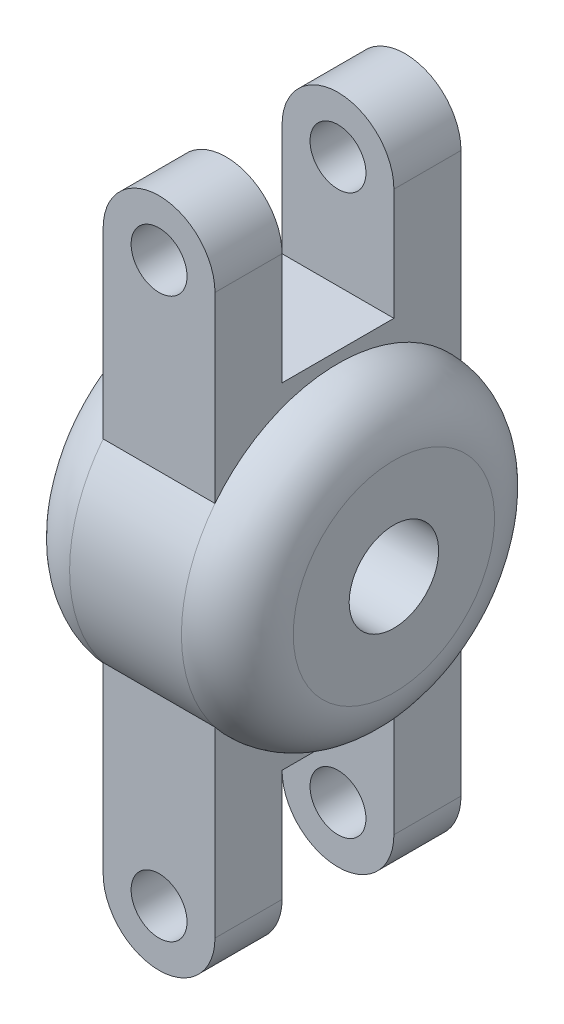
ISO-10303-21;
HEADER;
FILE_DESCRIPTION(('STEP AP214'),'2;1');
FILE_NAME('part.step','',(''),(''),'','','');
FILE_SCHEMA(('AUTOMOTIVE_DESIGN { 1 0 10303 214 1 1 1 1 }'));
ENDSEC;
DATA;
#1=APPLICATION_CONTEXT('core data for automotive mechanical design processes');
#2=APPLICATION_PROTOCOL_DEFINITION('international standard','automotive_design',2000,#1);
#3=PRODUCT_CONTEXT('',#1,'mechanical');
#4=PRODUCT('Part','Part','',(#3));
#5=PRODUCT_RELATED_PRODUCT_CATEGORY('part','',(#4));
#6=PRODUCT_DEFINITION_FORMATION('','',#4);
#7=PRODUCT_DEFINITION_CONTEXT('part definition',#1,'design');
#8=PRODUCT_DEFINITION('design','',#6,#7);
#9=PRODUCT_DEFINITION_SHAPE('','',#8);
#10=(LENGTH_UNIT() NAMED_UNIT(*) SI_UNIT(.MILLI.,.METRE.));
#11=(NAMED_UNIT(*) PLANE_ANGLE_UNIT() SI_UNIT($,.RADIAN.));
#12=(NAMED_UNIT(*) SI_UNIT($,.STERADIAN.) SOLID_ANGLE_UNIT());
#13=UNCERTAINTY_MEASURE_WITH_UNIT(LENGTH_MEASURE(1.E-05),#10,'distance_accuracy_value','');
#14=(GEOMETRIC_REPRESENTATION_CONTEXT(3) GLOBAL_UNCERTAINTY_ASSIGNED_CONTEXT((#13)) GLOBAL_UNIT_ASSIGNED_CONTEXT((#10,
#11,#12)) REPRESENTATION_CONTEXT('',''));
#15=CARTESIAN_POINT('',(0.,0.,0.));
#16=DIRECTION('',(0.,0.,1.));
#17=DIRECTION('',(1.,0.,0.));
#18=AXIS2_PLACEMENT_3D('',#15,#16,#17);
#19=CARTESIAN_POINT('',(44.0528610380754,-4.,11.));
#20=DIRECTION('',(1.,0.,0.));
#21=DIRECTION('',(0.,1.,0.));
#22=AXIS2_PLACEMENT_3D('',#19,#20,#21);
#23=PLANE('',#22);
#24=DIRECTION('',(0.,0.,1.));
#25=VECTOR('',#24,1.);
#26=CARTESIAN_POINT('',(44.0528610380754,-15.,-5.));
#27=LINE('',#26,#25);
#28=CARTESIAN_POINT('',(44.0528610380754,-15.,-5.));
#29=VERTEX_POINT('',#28);
#30=CARTESIAN_POINT('',(44.0528610380754,-15.,5.));
#31=VERTEX_POINT('',#30);
#32=EDGE_CURVE('E166',#29,#31,#27,.T.);
#33=ORIENTED_EDGE('',*,*,#32,.F.);
#34=DIRECTION('',(0.,-1.,0.));
#35=VECTOR('',#34,1.);
#36=CARTESIAN_POINT('',(44.0528610380754,-15.,-5.));
#37=LINE('',#36,#35);
#38=CARTESIAN_POINT('',(44.0528610380754,-25.,-5.));
#39=VERTEX_POINT('',#38);
#40=EDGE_CURVE('E152',#29,#39,#37,.T.);
#41=ORIENTED_EDGE('',*,*,#40,.T.);
#42=DIRECTION('',(0.,0.,-1.));
#43=VECTOR('',#42,1.);
#44=CARTESIAN_POINT('',(44.0528610380754,-25.,11.));
#45=LINE('',#44,#43);
#46=CARTESIAN_POINT('',(44.0528610380754,-25.,-11.));
#47=VERTEX_POINT('',#46);
#48=EDGE_CURVE('E163',#39,#47,#45,.T.);
#49=ORIENTED_EDGE('',*,*,#48,.T.);
#50=DIRECTION('',(0.,-1.,0.));
#51=VECTOR('',#50,1.);
#52=CARTESIAN_POINT('',(44.0528610380754,-4.,-11.));
#53=LINE('',#52,#51);
#54=CARTESIAN_POINT('',(44.0528610380754,-8.66025403784439,-11.));
#55=VERTEX_POINT('',#54);
#56=EDGE_CURVE('E292',#55,#47,#53,.T.);
#57=ORIENTED_EDGE('',*,*,#56,.F.);
#58=CARTESIAN_POINT('',(44.0528610380753,0.,0.));
#59=DIRECTION('',(-1.,0.,0.));
#60=DIRECTION('',(0.,0.,1.));
#61=AXIS2_PLACEMENT_3D('',#58,#59,#60);
#62=CIRCLE('',#61,14.);
#63=CARTESIAN_POINT('',(44.0528610380754,-8.66025403784439,11.));
#64=VERTEX_POINT('',#63);
#65=EDGE_CURVE('E305',#55,#64,#62,.T.);
#66=ORIENTED_EDGE('',*,*,#65,.T.);
#67=DIRECTION('',(0.,-1.,0.));
#68=VECTOR('',#67,1.);
#69=CARTESIAN_POINT('',(44.0528610380754,-4.,11.));
#70=LINE('',#69,#68);
#71=CARTESIAN_POINT('',(44.0528610380754,-25.,11.));
#72=VERTEX_POINT('',#71);
#73=EDGE_CURVE('E295',#64,#72,#70,.T.);
#74=ORIENTED_EDGE('',*,*,#73,.T.);
#75=CARTESIAN_POINT('',(44.0528610380754,-25.,5.));
#76=VERTEX_POINT('',#75);
#77=EDGE_CURVE('E173',#72,#76,#45,.T.);
#78=ORIENTED_EDGE('',*,*,#77,.T.);
#79=DIRECTION('',(0.,-1.,0.));
#80=VECTOR('',#79,1.);
#81=CARTESIAN_POINT('',(44.0528610380754,-15.,5.));
#82=LINE('',#81,#80);
#83=EDGE_CURVE('E49',#31,#76,#82,.T.);
#84=ORIENTED_EDGE('',*,*,#83,.F.);
#85=EDGE_LOOP('',(#33,#41,#49,#57,#66,#74,#78,#84));
#86=FACE_BOUND('',#85,.T.);
#87=ADVANCED_FACE('F32',(#86),#23,.T.);
#88=CARTESIAN_POINT('',(34.0528610380754,-4.,11.));
#89=DIRECTION('',(-1.,0.,0.));
#90=DIRECTION('',(0.,0.,1.));
#91=AXIS2_PLACEMENT_3D('',#88,#89,#90);
#92=PLANE('',#91);
#93=DIRECTION('',(0.,0.,-1.));
#94=VECTOR('',#93,1.);
#95=CARTESIAN_POINT('',(34.0528610380754,-25.,11.));
#96=LINE('',#95,#94);
#97=CARTESIAN_POINT('',(34.0528610380754,-25.,-5.));
#98=VERTEX_POINT('',#97);
#99=CARTESIAN_POINT('',(34.0528610380754,-25.,-11.));
#100=VERTEX_POINT('',#99);
#101=EDGE_CURVE('E177',#98,#100,#96,.T.);
#102=ORIENTED_EDGE('',*,*,#101,.F.);
#103=DIRECTION('',(0.,1.,0.));
#104=VECTOR('',#103,1.);
#105=CARTESIAN_POINT('',(34.0528610380754,-25.,-5.));
#106=LINE('',#105,#104);
#107=CARTESIAN_POINT('',(34.0528610380754,-15.,-5.));
#108=VERTEX_POINT('',#107);
#109=EDGE_CURVE('E155',#98,#108,#106,.T.);
#110=ORIENTED_EDGE('',*,*,#109,.T.);
#111=DIRECTION('',(0.,0.,1.));
#112=VECTOR('',#111,1.);
#113=CARTESIAN_POINT('',(34.0528610380754,-15.,-5.));
#114=LINE('',#113,#112);
#115=CARTESIAN_POINT('',(34.0528610380754,-15.,5.));
#116=VERTEX_POINT('',#115);
#117=EDGE_CURVE('E277',#108,#116,#114,.T.);
#118=ORIENTED_EDGE('',*,*,#117,.T.);
#119=DIRECTION('',(0.,1.,0.));
#120=VECTOR('',#119,1.);
#121=CARTESIAN_POINT('',(34.0528610380754,-25.,5.));
#122=LINE('',#121,#120);
#123=CARTESIAN_POINT('',(34.0528610380754,-25.,5.));
#124=VERTEX_POINT('',#123);
#125=EDGE_CURVE('E159',#124,#116,#122,.T.);
#126=ORIENTED_EDGE('',*,*,#125,.F.);
#127=CARTESIAN_POINT('',(34.0528610380754,-25.,11.));
#128=VERTEX_POINT('',#127);
#129=EDGE_CURVE('E183',#128,#124,#96,.T.);
#130=ORIENTED_EDGE('',*,*,#129,.F.);
#131=DIRECTION('',(0.,1.,0.));
#132=VECTOR('',#131,1.);
#133=CARTESIAN_POINT('',(34.0528610380754,-4.,11.));
#134=LINE('',#133,#132);
#135=CARTESIAN_POINT('',(34.0528610380754,-8.66025403784439,11.));
#136=VERTEX_POINT('',#135);
#137=EDGE_CURVE('E57',#128,#136,#134,.T.);
#138=ORIENTED_EDGE('',*,*,#137,.T.);
#139=CARTESIAN_POINT('',(34.0528610380754,0.,0.));
#140=DIRECTION('',(-1.,0.,0.));
#141=DIRECTION('',(0.,0.,1.));
#142=AXIS2_PLACEMENT_3D('',#139,#140,#141);
#143=CIRCLE('',#142,14.);
#144=CARTESIAN_POINT('',(34.0528610380754,-8.66025403784439,-11.));
#145=VERTEX_POINT('',#144);
#146=EDGE_CURVE('E363',#145,#136,#143,.T.);
#147=ORIENTED_EDGE('',*,*,#146,.F.);
#148=DIRECTION('',(0.,1.,0.));
#149=VECTOR('',#148,1.);
#150=CARTESIAN_POINT('',(34.0528610380754,-4.,-11.));
#151=LINE('',#150,#149);
#152=EDGE_CURVE('E298',#100,#145,#151,.T.);
#153=ORIENTED_EDGE('',*,*,#152,.F.);
#154=EDGE_LOOP('',(#102,#110,#118,#126,#130,#138,#147,#153));
#155=FACE_BOUND('',#154,.T.);
#156=ADVANCED_FACE('F362',(#155),#92,.T.);
#157=CARTESIAN_POINT('',(39.0528610380754,-25.,11.));
#158=DIRECTION('',(0.,0.,-1.));
#159=DIRECTION('',(-1.,0.,0.));
#160=AXIS2_PLACEMENT_3D('',#157,#158,#159);
#161=CYLINDRICAL_SURFACE('',#160,5.);
#162=ORIENTED_EDGE('',*,*,#48,.F.);
#163=CARTESIAN_POINT('',(39.0528610380754,-25.,-5.));
#164=DIRECTION('',(0.,0.,-1.));
#165=DIRECTION('',(1.,0.,0.));
#166=AXIS2_PLACEMENT_3D('',#163,#164,#165);
#167=CIRCLE('',#166,5.);
#168=EDGE_CURVE('E147',#39,#98,#167,.T.);
#169=ORIENTED_EDGE('',*,*,#168,.T.);
#170=ORIENTED_EDGE('',*,*,#101,.T.);
#171=CARTESIAN_POINT('',(39.0528610380754,-25.,-11.));
#172=DIRECTION('',(0.,0.,-1.));
#173=DIRECTION('',(1.,0.,0.));
#174=AXIS2_PLACEMENT_3D('',#171,#172,#173);
#175=CIRCLE('',#174,5.);
#176=EDGE_CURVE('E172',#47,#100,#175,.T.);
#177=ORIENTED_EDGE('',*,*,#176,.F.);
#178=EDGE_LOOP('',(#162,#169,#170,#177));
#179=FACE_BOUND('',#178,.T.);
#180=ADVANCED_FACE('F170',(#179),#161,.T.);
#181=CARTESIAN_POINT('',(39.0528610380754,-25.,11.));
#182=DIRECTION('',(0.,0.,-1.));
#183=DIRECTION('',(-1.,0.,0.));
#184=AXIS2_PLACEMENT_3D('',#181,#182,#183);
#185=CYLINDRICAL_SURFACE('',#184,2.5);
#186=CARTESIAN_POINT('',(39.0528610380754,-25.,-11.));
#187=DIRECTION('',(0.,0.,-1.));
#188=DIRECTION('',(1.,0.,0.));
#189=AXIS2_PLACEMENT_3D('',#186,#187,#188);
#190=CIRCLE('',#189,2.5);
#191=CARTESIAN_POINT('',(41.5528610380754,-25.,-11.));
#192=VERTEX_POINT('',#191);
#193=EDGE_CURVE('E281',#192,#192,#190,.T.);
#194=ORIENTED_EDGE('',*,*,#193,.T.);
#195=EDGE_LOOP('',(#194));
#196=FACE_BOUND('',#195,.T.);
#197=CARTESIAN_POINT('',(39.0528610380754,-25.,-5.));
#198=DIRECTION('',(0.,0.,1.));
#199=DIRECTION('',(1.,0.,0.));
#200=AXIS2_PLACEMENT_3D('',#197,#198,#199);
#201=CIRCLE('',#200,2.5);
#202=CARTESIAN_POINT('',(41.5528610380754,-25.,-5.));
#203=VERTEX_POINT('',#202);
#204=EDGE_CURVE('E36',#203,#203,#201,.F.);
#205=ORIENTED_EDGE('',*,*,#204,.F.);
#206=EDGE_LOOP('',(#205));
#207=FACE_BOUND('',#206,.T.);
#208=ADVANCED_FACE('F491',(#196,#207),#185,.F.);
#209=CARTESIAN_POINT('',(27.6320773492058,0.,0.));
#210=DIRECTION('',(-1.,0.,0.));
#211=DIRECTION('',(0.,0.,1.));
#212=AXIS2_PLACEMENT_3D('',#209,#210,#211);
#213=CYLINDRICAL_SURFACE('',#212,14.);
#214=DIRECTION('',(-1.,0.,0.));
#215=VECTOR('',#214,1.);
#216=CARTESIAN_POINT('',(27.6320773492058,-8.66025403784439,-11.));
#217=LINE('',#216,#215);
#218=EDGE_CURVE('E186',#145,#55,#217,.F.);
#219=ORIENTED_EDGE('',*,*,#218,.F.);
#220=CARTESIAN_POINT('',(34.0528610380754,8.66025403784439,-11.));
#221=VERTEX_POINT('',#220);
#222=EDGE_CURVE('E228',#221,#145,#143,.T.);
#223=ORIENTED_EDGE('',*,*,#222,.F.);
#224=DIRECTION('',(-1.,0.,0.));
#225=VECTOR('',#224,1.);
#226=CARTESIAN_POINT('',(27.6320773492058,8.66025403784439,-11.));
#227=LINE('',#226,#225);
#228=CARTESIAN_POINT('',(44.0528610380754,8.66025403784439,-11.));
#229=VERTEX_POINT('',#228);
#230=EDGE_CURVE('E241',#221,#229,#227,.F.);
#231=ORIENTED_EDGE('',*,*,#230,.T.);
#232=EDGE_CURVE('E232',#229,#55,#62,.T.);
#233=ORIENTED_EDGE('',*,*,#232,.T.);
#234=EDGE_LOOP('',(#219,#223,#231,#233));
#235=FACE_BOUND('',#234,.T.);
#236=ADVANCED_FACE('F315',(#235),#213,.T.);
#237=CARTESIAN_POINT('',(44.0528610380754,4.,11.));
#238=DIRECTION('',(-1.,0.,0.));
#239=DIRECTION('',(0.,-1.,0.));
#240=AXIS2_PLACEMENT_3D('',#237,#238,#239);
#241=PLANE('',#240);
#242=DIRECTION('',(0.,1.,0.));
#243=VECTOR('',#242,1.);
#244=CARTESIAN_POINT('',(44.0528610380754,15.,-5.));
#245=LINE('',#244,#243);
#246=CARTESIAN_POINT('',(44.0528610380754,15.,-5.));
#247=VERTEX_POINT('',#246);
#248=CARTESIAN_POINT('',(44.0528610380754,25.,-5.));
#249=VERTEX_POINT('',#248);
#250=EDGE_CURVE('E201',#247,#249,#245,.T.);
#251=ORIENTED_EDGE('',*,*,#250,.F.);
#252=DIRECTION('',(0.,0.,1.));
#253=VECTOR('',#252,1.);
#254=CARTESIAN_POINT('',(44.0528610380754,15.,-5.));
#255=LINE('',#254,#253);
#256=CARTESIAN_POINT('',(44.0528610380754,15.,5.));
#257=VERTEX_POINT('',#256);
#258=EDGE_CURVE('E213',#247,#257,#255,.T.);
#259=ORIENTED_EDGE('',*,*,#258,.T.);
#260=DIRECTION('',(0.,1.,0.));
#261=VECTOR('',#260,1.);
#262=CARTESIAN_POINT('',(44.0528610380754,15.,5.));
#263=LINE('',#262,#261);
#264=CARTESIAN_POINT('',(44.0528610380754,25.,5.));
#265=VERTEX_POINT('',#264);
#266=EDGE_CURVE('E195',#257,#265,#263,.T.);
#267=ORIENTED_EDGE('',*,*,#266,.T.);
#268=DIRECTION('',(0.,0.,-1.));
#269=VECTOR('',#268,1.);
#270=CARTESIAN_POINT('',(44.0528610380754,25.,11.));
#271=LINE('',#270,#269);
#272=CARTESIAN_POINT('',(44.0528610380754,25.,11.));
#273=VERTEX_POINT('',#272);
#274=EDGE_CURVE('E11',#273,#265,#271,.T.);
#275=ORIENTED_EDGE('',*,*,#274,.F.);
#276=DIRECTION('',(0.,1.,0.));
#277=VECTOR('',#276,1.);
#278=CARTESIAN_POINT('',(44.0528610380754,4.,11.));
#279=LINE('',#278,#277);
#280=CARTESIAN_POINT('',(44.0528610380754,8.66025403784439,11.));
#281=VERTEX_POINT('',#280);
#282=EDGE_CURVE('E254',#281,#273,#279,.T.);
#283=ORIENTED_EDGE('',*,*,#282,.F.);
#284=EDGE_CURVE('E229',#281,#229,#62,.T.);
#285=ORIENTED_EDGE('',*,*,#284,.T.);
#286=DIRECTION('',(0.,1.,0.));
#287=VECTOR('',#286,1.);
#288=CARTESIAN_POINT('',(44.0528610380754,4.,-11.));
#289=LINE('',#288,#287);
#290=CARTESIAN_POINT('',(44.0528610380754,25.,-11.));
#291=VERTEX_POINT('',#290);
#292=EDGE_CURVE('E251',#229,#291,#289,.T.);
#293=ORIENTED_EDGE('',*,*,#292,.T.);
#294=EDGE_CURVE('E41',#249,#291,#271,.T.);
#295=ORIENTED_EDGE('',*,*,#294,.F.);
#296=EDGE_LOOP('',(#251,#259,#267,#275,#283,#285,#293,#295));
#297=FACE_BOUND('',#296,.T.);
#298=ADVANCED_FACE('F34',(#297),#241,.F.);
#299=CARTESIAN_POINT('',(39.0528610380754,25.,11.));
#300=DIRECTION('',(0.,0.,-1.));
#301=DIRECTION('',(-1.,0.,0.));
#302=AXIS2_PLACEMENT_3D('',#299,#300,#301);
#303=CYLINDRICAL_SURFACE('',#302,5.);
#304=CARTESIAN_POINT('',(39.0528610380754,25.,-5.));
#305=DIRECTION('',(0.,0.,1.));
#306=DIRECTION('',(1.,0.,0.));
#307=AXIS2_PLACEMENT_3D('',#304,#305,#306);
#308=CIRCLE('',#307,5.);
#309=CARTESIAN_POINT('',(34.0528610380754,25.,-5.));
#310=VERTEX_POINT('',#309);
#311=EDGE_CURVE('E192',#249,#310,#308,.T.);
#312=ORIENTED_EDGE('',*,*,#311,.F.);
#313=ORIENTED_EDGE('',*,*,#294,.T.);
#314=CARTESIAN_POINT('',(39.0528610380754,25.,-11.));
#315=DIRECTION('',(0.,0.,1.));
#316=DIRECTION('',(1.,0.,0.));
#317=AXIS2_PLACEMENT_3D('',#314,#315,#316);
#318=CIRCLE('',#317,5.);
#319=CARTESIAN_POINT('',(34.0528610380754,25.,-11.));
#320=VERTEX_POINT('',#319);
#321=EDGE_CURVE('E265',#291,#320,#318,.T.);
#322=ORIENTED_EDGE('',*,*,#321,.T.);
#323=DIRECTION('',(0.,0.,-1.));
#324=VECTOR('',#323,1.);
#325=CARTESIAN_POINT('',(34.0528610380754,25.,11.));
#326=LINE('',#325,#324);
#327=EDGE_CURVE('E262',#310,#320,#326,.T.);
#328=ORIENTED_EDGE('',*,*,#327,.F.);
#329=EDGE_LOOP('',(#312,#313,#322,#328));
#330=FACE_BOUND('',#329,.T.);
#331=ADVANCED_FACE('F406',(#330),#303,.T.);
#332=CARTESIAN_POINT('',(34.0528610380754,4.,11.));
#333=DIRECTION('',(1.,0.,0.));
#334=DIRECTION('',(0.,0.,-1.));
#335=AXIS2_PLACEMENT_3D('',#332,#333,#334);
#336=PLANE('',#335);
#337=DIRECTION('',(0.,-1.,0.));
#338=VECTOR('',#337,1.);
#339=CARTESIAN_POINT('',(34.0528610380754,25.,-5.));
#340=LINE('',#339,#338);
#341=CARTESIAN_POINT('',(34.0528610380754,15.,-5.));
#342=VERTEX_POINT('',#341);
#343=EDGE_CURVE('E194',#310,#342,#340,.T.);
#344=ORIENTED_EDGE('',*,*,#343,.F.);
#345=ORIENTED_EDGE('',*,*,#327,.T.);
#346=DIRECTION('',(0.,-1.,0.));
#347=VECTOR('',#346,1.);
#348=CARTESIAN_POINT('',(34.0528610380754,4.,-11.));
#349=LINE('',#348,#347);
#350=EDGE_CURVE('E257',#320,#221,#349,.T.);
#351=ORIENTED_EDGE('',*,*,#350,.T.);
#352=CARTESIAN_POINT('',(34.0528610380754,8.66025403784439,11.));
#353=VERTEX_POINT('',#352);
#354=EDGE_CURVE('E224',#353,#221,#143,.T.);
#355=ORIENTED_EDGE('',*,*,#354,.F.);
#356=DIRECTION('',(0.,-1.,0.));
#357=VECTOR('',#356,1.);
#358=CARTESIAN_POINT('',(34.0528610380754,4.,11.));
#359=LINE('',#358,#357);
#360=CARTESIAN_POINT('',(34.0528610380754,25.,11.));
#361=VERTEX_POINT('',#360);
#362=EDGE_CURVE('E259',#361,#353,#359,.T.);
#363=ORIENTED_EDGE('',*,*,#362,.F.);
#364=CARTESIAN_POINT('',(34.0528610380754,25.,5.));
#365=VERTEX_POINT('',#364);
#366=EDGE_CURVE('E269',#361,#365,#326,.T.);
#367=ORIENTED_EDGE('',*,*,#366,.T.);
#368=DIRECTION('',(0.,-1.,0.));
#369=VECTOR('',#368,1.);
#370=CARTESIAN_POINT('',(34.0528610380754,25.,5.));
#371=LINE('',#370,#369);
#372=CARTESIAN_POINT('',(34.0528610380754,15.,5.));
#373=VERTEX_POINT('',#372);
#374=EDGE_CURVE('E206',#365,#373,#371,.T.);
#375=ORIENTED_EDGE('',*,*,#374,.T.);
#376=DIRECTION('',(0.,0.,1.));
#377=VECTOR('',#376,1.);
#378=CARTESIAN_POINT('',(34.0528610380754,15.,-5.));
#379=LINE('',#378,#377);
#380=EDGE_CURVE('E203',#342,#373,#379,.T.);
#381=ORIENTED_EDGE('',*,*,#380,.F.);
#382=EDGE_LOOP('',(#344,#345,#351,#355,#363,#367,#375,#381));
#383=FACE_BOUND('',#382,.T.);
#384=ADVANCED_FACE('F340',(#383),#336,.F.);
#385=CARTESIAN_POINT('',(39.0528610380754,25.,11.));
#386=DIRECTION('',(0.,0.,-1.));
#387=DIRECTION('',(-1.,0.,0.));
#388=AXIS2_PLACEMENT_3D('',#385,#386,#387);
#389=CYLINDRICAL_SURFACE('',#388,2.5);
#390=CARTESIAN_POINT('',(39.0528610380754,25.,-11.));
#391=DIRECTION('',(0.,0.,1.));
#392=DIRECTION('',(1.,0.,0.));
#393=AXIS2_PLACEMENT_3D('',#390,#391,#392);
#394=CIRCLE('',#393,2.5);
#395=CARTESIAN_POINT('',(41.5528610380754,25.,-11.));
#396=VERTEX_POINT('',#395);
#397=EDGE_CURVE('E247',#396,#396,#394,.T.);
#398=ORIENTED_EDGE('',*,*,#397,.F.);
#399=EDGE_LOOP('',(#398));
#400=FACE_BOUND('',#399,.T.);
#401=CARTESIAN_POINT('',(39.0528610380754,25.,-5.));
#402=DIRECTION('',(0.,0.,1.));
#403=DIRECTION('',(1.,0.,0.));
#404=AXIS2_PLACEMENT_3D('',#401,#402,#403);
#405=CIRCLE('',#404,2.5);
#406=CARTESIAN_POINT('',(41.5528610380754,25.,-5.));
#407=VERTEX_POINT('',#406);
#408=EDGE_CURVE('E223',#407,#407,#405,.T.);
#409=ORIENTED_EDGE('',*,*,#408,.T.);
#410=EDGE_LOOP('',(#409));
#411=FACE_BOUND('',#410,.T.);
#412=ADVANCED_FACE('F412',(#400,#411),#389,.F.);
#413=CARTESIAN_POINT('',(39.0528610380754,25.,11.));
#414=DIRECTION('',(0.,0.,1.));
#415=DIRECTION('',(1.,0.,0.));
#416=AXIS2_PLACEMENT_3D('',#413,#414,#415);
#417=PLANE('',#416);
#418=CARTESIAN_POINT('',(39.0528610380754,25.,11.));
#419=DIRECTION('',(0.,0.,1.));
#420=DIRECTION('',(1.,0.,0.));
#421=AXIS2_PLACEMENT_3D('',#418,#419,#420);
#422=CIRCLE('',#421,2.5);
#423=CARTESIAN_POINT('',(41.5528610380754,25.,11.));
#424=VERTEX_POINT('',#423);
#425=EDGE_CURVE('E248',#424,#424,#422,.T.);
#426=ORIENTED_EDGE('',*,*,#425,.F.);
#427=EDGE_LOOP('',(#426));
#428=FACE_BOUND('',#427,.T.);
#429=ORIENTED_EDGE('',*,*,#362,.T.);
#430=DIRECTION('',(-1.,0.,0.));
#431=VECTOR('',#430,1.);
#432=CARTESIAN_POINT('',(27.6320773492058,8.66025403784439,11.));
#433=LINE('',#432,#431);
#434=EDGE_CURVE('E244',#353,#281,#433,.F.);
#435=ORIENTED_EDGE('',*,*,#434,.T.);
#436=ORIENTED_EDGE('',*,*,#282,.T.);
#437=CARTESIAN_POINT('',(39.0528610380754,25.,11.));
#438=DIRECTION('',(0.,0.,1.));
#439=DIRECTION('',(1.,0.,0.));
#440=AXIS2_PLACEMENT_3D('',#437,#438,#439);
#441=CIRCLE('',#440,5.);
#442=EDGE_CURVE('E256',#273,#361,#441,.T.);
#443=ORIENTED_EDGE('',*,*,#442,.T.);
#444=EDGE_LOOP('',(#429,#435,#436,#443));
#445=FACE_BOUND('',#444,.T.);
#446=ADVANCED_FACE('F331',(#428,#445),#417,.T.);
#447=CARTESIAN_POINT('',(39.0528610380754,25.,-11.));
#448=DIRECTION('',(0.,0.,1.));
#449=DIRECTION('',(1.,0.,0.));
#450=AXIS2_PLACEMENT_3D('',#447,#448,#449);
#451=PLANE('',#450);
#452=ORIENTED_EDGE('',*,*,#397,.T.);
#453=EDGE_LOOP('',(#452));
#454=FACE_BOUND('',#453,.T.);
#455=ORIENTED_EDGE('',*,*,#230,.F.);
#456=ORIENTED_EDGE('',*,*,#350,.F.);
#457=ORIENTED_EDGE('',*,*,#321,.F.);
#458=ORIENTED_EDGE('',*,*,#292,.F.);
#459=EDGE_LOOP('',(#455,#456,#457,#458));
#460=FACE_BOUND('',#459,.T.);
#461=ADVANCED_FACE('F322',(#454,#460),#451,.F.);
#462=ORIENTED_EDGE('',*,*,#274,.T.);
#463=CARTESIAN_POINT('',(39.0528610380754,25.,5.));
#464=DIRECTION('',(0.,0.,1.));
#465=DIRECTION('',(1.,0.,0.));
#466=AXIS2_PLACEMENT_3D('',#463,#464,#465);
#467=CIRCLE('',#466,5.);
#468=EDGE_CURVE('E191',#265,#365,#467,.T.);
#469=ORIENTED_EDGE('',*,*,#468,.T.);
#470=ORIENTED_EDGE('',*,*,#366,.F.);
#471=ORIENTED_EDGE('',*,*,#442,.F.);
#472=EDGE_LOOP('',(#462,#469,#470,#471));
#473=FACE_BOUND('',#472,.T.);
#474=ADVANCED_FACE('F335',(#473),#303,.T.);
#475=CARTESIAN_POINT('',(39.0528610380754,25.,5.));
#476=DIRECTION('',(0.,0.,1.));
#477=DIRECTION('',(1.,0.,0.));
#478=AXIS2_PLACEMENT_3D('',#475,#476,#477);
#479=CIRCLE('',#478,2.5);
#480=CARTESIAN_POINT('',(41.5528610380754,25.,5.));
#481=VERTEX_POINT('',#480);
#482=EDGE_CURVE('E216',#481,#481,#479,.T.);
#483=ORIENTED_EDGE('',*,*,#482,.F.);
#484=EDGE_LOOP('',(#483));
#485=FACE_BOUND('',#484,.T.);
#486=ORIENTED_EDGE('',*,*,#425,.T.);
#487=EDGE_LOOP('',(#486));
#488=FACE_BOUND('',#487,.T.);
#489=ADVANCED_FACE('F415',(#485,#488),#389,.F.);
#490=CARTESIAN_POINT('',(29.0528610380754,4.,0.));
#491=DIRECTION('',(1.,0.,0.));
#492=DIRECTION('',(0.,0.,-1.));
#493=AXIS2_PLACEMENT_3D('',#490,#491,#492);
#494=PLANE('',#493);
#495=CARTESIAN_POINT('',(29.0528610380754,0.,0.));
#496=DIRECTION('',(-1.,0.,0.));
#497=DIRECTION('',(0.,0.,1.));
#498=AXIS2_PLACEMENT_3D('',#495,#496,#497);
#499=CIRCLE('',#498,4.);
#500=CARTESIAN_POINT('',(29.0528610380754,0.,4.));
#501=VERTEX_POINT('',#500);
#502=EDGE_CURVE('E238',#501,#501,#499,.T.);
#503=ORIENTED_EDGE('',*,*,#502,.F.);
#504=EDGE_LOOP('',(#503));
#505=FACE_BOUND('',#504,.T.);
#506=CARTESIAN_POINT('',(29.0528610380754,0.,0.));
#507=DIRECTION('',(-1.,0.,0.));
#508=DIRECTION('',(0.,0.,1.));
#509=AXIS2_PLACEMENT_3D('',#506,#507,#508);
#510=CIRCLE('',#509,8.99999999999997);
#511=CARTESIAN_POINT('',(29.0528610380754,0.,8.99999999999997));
#512=VERTEX_POINT('',#511);
#513=EDGE_CURVE('E219',#512,#512,#510,.T.);
#514=ORIENTED_EDGE('',*,*,#513,.T.);
#515=EDGE_LOOP('',(#514));
#516=FACE_BOUND('',#515,.T.);
#517=ADVANCED_FACE('F420',(#505,#516),#494,.F.);
#518=CARTESIAN_POINT('',(27.6320773492058,0.,0.));
#519=DIRECTION('',(-1.,0.,0.));
#520=DIRECTION('',(0.,0.,1.));
#521=AXIS2_PLACEMENT_3D('',#518,#519,#520);
#522=CYLINDRICAL_SURFACE('',#521,4.);
#523=CARTESIAN_POINT('',(49.0528610380754,0.,0.));
#524=DIRECTION('',(-1.,0.,0.));
#525=DIRECTION('',(0.,0.,1.));
#526=AXIS2_PLACEMENT_3D('',#523,#524,#525);
#527=CIRCLE('',#526,4.);
#528=CARTESIAN_POINT('',(49.0528610380754,0.,4.));
#529=VERTEX_POINT('',#528);
#530=EDGE_CURVE('E235',#529,#529,#527,.T.);
#531=ORIENTED_EDGE('',*,*,#530,.F.);
#532=EDGE_LOOP('',(#531));
#533=FACE_BOUND('',#532,.T.);
#534=ORIENTED_EDGE('',*,*,#502,.T.);
#535=EDGE_LOOP('',(#534));
#536=FACE_BOUND('',#535,.T.);
#537=ADVANCED_FACE('F433',(#533,#536),#522,.F.);
#538=CARTESIAN_POINT('',(49.0528610380754,4.,0.));
#539=DIRECTION('',(-1.,0.,0.));
#540=DIRECTION('',(0.,0.,1.));
#541=AXIS2_PLACEMENT_3D('',#538,#539,#540);
#542=PLANE('',#541);
#543=CARTESIAN_POINT('',(49.0528610380754,0.,0.));
#544=DIRECTION('',(-1.,0.,0.));
#545=DIRECTION('',(0.,0.,1.));
#546=AXIS2_PLACEMENT_3D('',#543,#544,#545);
#547=CIRCLE('',#546,8.99999999999997);
#548=CARTESIAN_POINT('',(49.0528610380754,0.,8.99999999999997));
#549=VERTEX_POINT('',#548);
#550=EDGE_CURVE('E231',#549,#549,#547,.T.);
#551=ORIENTED_EDGE('',*,*,#550,.F.);
#552=EDGE_LOOP('',(#551));
#553=FACE_BOUND('',#552,.T.);
#554=ORIENTED_EDGE('',*,*,#530,.T.);
#555=EDGE_LOOP('',(#554));
#556=FACE_BOUND('',#555,.T.);
#557=ADVANCED_FACE('F437',(#553,#556),#542,.F.);
#558=CARTESIAN_POINT('',(44.0528610380754,0.,0.));
#559=DIRECTION('',(-1.,0.,0.));
#560=DIRECTION('',(0.,0.,1.));
#561=AXIS2_PLACEMENT_3D('',#558,#559,#560);
#562=TOROIDAL_SURFACE('',#561,9.,5.);
#563=ORIENTED_EDGE('',*,*,#284,.F.);
#564=EDGE_CURVE('E227',#64,#281,#62,.T.);
#565=ORIENTED_EDGE('',*,*,#564,.F.);
#566=ORIENTED_EDGE('',*,*,#65,.F.);
#567=ORIENTED_EDGE('',*,*,#232,.F.);
#568=EDGE_LOOP('',(#563,#565,#566,#567));
#569=FACE_BOUND('',#568,.T.);
#570=ORIENTED_EDGE('',*,*,#550,.T.);
#571=EDGE_LOOP('',(#570));
#572=FACE_BOUND('',#571,.T.);
#573=ADVANCED_FACE('F312',(#569,#572),#562,.T.);
#574=EDGE_CURVE('E222',#136,#353,#143,.T.);
#575=ORIENTED_EDGE('',*,*,#574,.F.);
#576=DIRECTION('',(-1.,0.,0.));
#577=VECTOR('',#576,1.);
#578=CARTESIAN_POINT('',(27.6320773492058,-8.66025403784439,11.));
#579=LINE('',#578,#577);
#580=EDGE_CURVE('E188',#136,#64,#579,.F.);
#581=ORIENTED_EDGE('',*,*,#580,.T.);
#582=ORIENTED_EDGE('',*,*,#564,.T.);
#583=ORIENTED_EDGE('',*,*,#434,.F.);
#584=EDGE_LOOP('',(#575,#581,#582,#583));
#585=FACE_BOUND('',#584,.T.);
#586=ADVANCED_FACE('F343',(#585),#213,.T.);
#587=CARTESIAN_POINT('',(34.0528610380754,0.,0.));
#588=DIRECTION('',(-1.,0.,0.));
#589=DIRECTION('',(0.,0.,1.));
#590=AXIS2_PLACEMENT_3D('',#587,#588,#589);
#591=TOROIDAL_SURFACE('',#590,9.,5.);
#592=ORIENTED_EDGE('',*,*,#513,.F.);
#593=EDGE_LOOP('',(#592));
#594=FACE_BOUND('',#593,.T.);
#595=ORIENTED_EDGE('',*,*,#354,.T.);
#596=ORIENTED_EDGE('',*,*,#222,.T.);
#597=ORIENTED_EDGE('',*,*,#146,.T.);
#598=ORIENTED_EDGE('',*,*,#574,.T.);
#599=EDGE_LOOP('',(#595,#596,#597,#598));
#600=FACE_BOUND('',#599,.T.);
#601=ADVANCED_FACE('F365',(#594,#600),#591,.T.);
#602=CARTESIAN_POINT('',(34.0528610380754,15.,-5.));
#603=DIRECTION('',(0.,-1.,0.));
#604=DIRECTION('',(0.,0.,-1.));
#605=AXIS2_PLACEMENT_3D('',#602,#603,#604);
#606=PLANE('',#605);
#607=DIRECTION('',(1.,0.,0.));
#608=VECTOR('',#607,1.);
#609=CARTESIAN_POINT('',(34.0528610380754,15.,5.));
#610=LINE('',#609,#608);
#611=EDGE_CURVE('E209',#373,#257,#610,.T.);
#612=ORIENTED_EDGE('',*,*,#611,.T.);
#613=ORIENTED_EDGE('',*,*,#258,.F.);
#614=DIRECTION('',(1.,0.,0.));
#615=VECTOR('',#614,1.);
#616=CARTESIAN_POINT('',(34.0528610380754,15.,-5.));
#617=LINE('',#616,#615);
#618=EDGE_CURVE('E198',#342,#247,#617,.T.);
#619=ORIENTED_EDGE('',*,*,#618,.F.);
#620=ORIENTED_EDGE('',*,*,#380,.T.);
#621=EDGE_LOOP('',(#612,#613,#619,#620));
#622=FACE_BOUND('',#621,.T.);
#623=ADVANCED_FACE('F367',(#622),#606,.F.);
#624=CARTESIAN_POINT('',(39.0528610380754,25.,-5.));
#625=DIRECTION('',(0.,0.,1.));
#626=DIRECTION('',(1.,0.,0.));
#627=AXIS2_PLACEMENT_3D('',#624,#625,#626);
#628=PLANE('',#627);
#629=ORIENTED_EDGE('',*,*,#408,.F.);
#630=EDGE_LOOP('',(#629));
#631=FACE_BOUND('',#630,.T.);
#632=ORIENTED_EDGE('',*,*,#311,.T.);
#633=ORIENTED_EDGE('',*,*,#343,.T.);
#634=ORIENTED_EDGE('',*,*,#618,.T.);
#635=ORIENTED_EDGE('',*,*,#250,.T.);
#636=EDGE_LOOP('',(#632,#633,#634,#635));
#637=FACE_BOUND('',#636,.T.);
#638=ADVANCED_FACE('F374',(#631,#637),#628,.T.);
#639=CARTESIAN_POINT('',(39.0528610380754,25.,5.));
#640=DIRECTION('',(0.,0.,1.));
#641=DIRECTION('',(1.,0.,0.));
#642=AXIS2_PLACEMENT_3D('',#639,#640,#641);
#643=PLANE('',#642);
#644=ORIENTED_EDGE('',*,*,#482,.T.);
#645=EDGE_LOOP('',(#644));
#646=FACE_BOUND('',#645,.T.);
#647=ORIENTED_EDGE('',*,*,#468,.F.);
#648=ORIENTED_EDGE('',*,*,#266,.F.);
#649=ORIENTED_EDGE('',*,*,#611,.F.);
#650=ORIENTED_EDGE('',*,*,#374,.F.);
#651=EDGE_LOOP('',(#647,#648,#649,#650));
#652=FACE_BOUND('',#651,.T.);
#653=ADVANCED_FACE('F389',(#646,#652),#643,.F.);
#654=CARTESIAN_POINT('',(39.0528610380754,-25.,11.));
#655=DIRECTION('',(0.,0.,1.));
#656=DIRECTION('',(1.,0.,0.));
#657=AXIS2_PLACEMENT_3D('',#654,#655,#656);
#658=PLANE('',#657);
#659=CARTESIAN_POINT('',(39.0528610380754,-25.,11.));
#660=DIRECTION('',(0.,0.,-1.));
#661=DIRECTION('',(1.,0.,0.));
#662=AXIS2_PLACEMENT_3D('',#659,#660,#661);
#663=CIRCLE('',#662,2.5);
#664=CARTESIAN_POINT('',(41.5528610380754,-25.,11.));
#665=VERTEX_POINT('',#664);
#666=EDGE_CURVE('E289',#665,#665,#663,.T.);
#667=ORIENTED_EDGE('',*,*,#666,.T.);
#668=EDGE_LOOP('',(#667));
#669=FACE_BOUND('',#668,.T.);
#670=ORIENTED_EDGE('',*,*,#580,.F.);
#671=ORIENTED_EDGE('',*,*,#137,.F.);
#672=CARTESIAN_POINT('',(39.0528610380754,-25.,11.));
#673=DIRECTION('',(0.,0.,-1.));
#674=DIRECTION('',(1.,0.,0.));
#675=AXIS2_PLACEMENT_3D('',#672,#673,#674);
#676=CIRCLE('',#675,5.);
#677=EDGE_CURVE('E174',#72,#128,#676,.T.);
#678=ORIENTED_EDGE('',*,*,#677,.F.);
#679=ORIENTED_EDGE('',*,*,#73,.F.);
#680=EDGE_LOOP('',(#670,#671,#678,#679));
#681=FACE_BOUND('',#680,.T.);
#682=ADVANCED_FACE('F346',(#669,#681),#658,.T.);
#683=CARTESIAN_POINT('',(39.0528610380754,-25.,-11.));
#684=DIRECTION('',(0.,0.,1.));
#685=DIRECTION('',(1.,0.,0.));
#686=AXIS2_PLACEMENT_3D('',#683,#684,#685);
#687=PLANE('',#686);
#688=ORIENTED_EDGE('',*,*,#193,.F.);
#689=EDGE_LOOP('',(#688));
#690=FACE_BOUND('',#689,.T.);
#691=ORIENTED_EDGE('',*,*,#152,.T.);
#692=ORIENTED_EDGE('',*,*,#218,.T.);
#693=ORIENTED_EDGE('',*,*,#56,.T.);
#694=ORIENTED_EDGE('',*,*,#176,.T.);
#695=EDGE_LOOP('',(#691,#692,#693,#694));
#696=FACE_BOUND('',#695,.T.);
#697=ADVANCED_FACE('F303',(#690,#696),#687,.F.);
#698=CARTESIAN_POINT('',(39.0528610380754,-25.,5.));
#699=DIRECTION('',(0.,0.,-1.));
#700=DIRECTION('',(1.,0.,0.));
#701=AXIS2_PLACEMENT_3D('',#698,#699,#700);
#702=CIRCLE('',#701,5.);
#703=EDGE_CURVE('E351',#76,#124,#702,.T.);
#704=ORIENTED_EDGE('',*,*,#703,.F.);
#705=ORIENTED_EDGE('',*,*,#77,.F.);
#706=ORIENTED_EDGE('',*,*,#677,.T.);
#707=ORIENTED_EDGE('',*,*,#129,.T.);
#708=EDGE_LOOP('',(#704,#705,#706,#707));
#709=FACE_BOUND('',#708,.T.);
#710=ADVANCED_FACE('F350',(#709),#161,.T.);
#711=CARTESIAN_POINT('',(39.0528610380754,-25.,5.));
#712=DIRECTION('',(0.,0.,1.));
#713=DIRECTION('',(1.,0.,0.));
#714=AXIS2_PLACEMENT_3D('',#711,#712,#713);
#715=CIRCLE('',#714,2.5);
#716=CARTESIAN_POINT('',(41.5528610380754,-25.,5.));
#717=VERTEX_POINT('',#716);
#718=EDGE_CURVE('E275',#717,#717,#715,.F.);
#719=ORIENTED_EDGE('',*,*,#718,.T.);
#720=EDGE_LOOP('',(#719));
#721=FACE_BOUND('',#720,.T.);
#722=ORIENTED_EDGE('',*,*,#666,.F.);
#723=EDGE_LOOP('',(#722));
#724=FACE_BOUND('',#723,.T.);
#725=ADVANCED_FACE('F482',(#721,#724),#185,.F.);
#726=CARTESIAN_POINT('',(39.0528610380754,-25.,-5.));
#727=DIRECTION('',(0.,0.,1.));
#728=DIRECTION('',(1.,0.,0.));
#729=AXIS2_PLACEMENT_3D('',#726,#727,#728);
#730=PLANE('',#729);
#731=ORIENTED_EDGE('',*,*,#168,.F.);
#732=ORIENTED_EDGE('',*,*,#40,.F.);
#733=DIRECTION('',(1.,0.,0.));
#734=VECTOR('',#733,1.);
#735=CARTESIAN_POINT('',(34.0528610380754,-15.,-5.));
#736=LINE('',#735,#734);
#737=EDGE_CURVE('E167',#108,#29,#736,.T.);
#738=ORIENTED_EDGE('',*,*,#737,.F.);
#739=ORIENTED_EDGE('',*,*,#109,.F.);
#740=EDGE_LOOP('',(#731,#732,#738,#739));
#741=FACE_BOUND('',#740,.T.);
#742=ORIENTED_EDGE('',*,*,#204,.T.);
#743=EDGE_LOOP('',(#742));
#744=FACE_BOUND('',#743,.T.);
#745=ADVANCED_FACE('F149',(#741,#744),#730,.T.);
#746=CARTESIAN_POINT('',(39.0528610380754,-25.,5.));
#747=DIRECTION('',(0.,0.,1.));
#748=DIRECTION('',(1.,0.,0.));
#749=AXIS2_PLACEMENT_3D('',#746,#747,#748);
#750=PLANE('',#749);
#751=ORIENTED_EDGE('',*,*,#703,.T.);
#752=ORIENTED_EDGE('',*,*,#125,.T.);
#753=DIRECTION('',(1.,0.,0.));
#754=VECTOR('',#753,1.);
#755=CARTESIAN_POINT('',(34.0528610380754,-15.,5.));
#756=LINE('',#755,#754);
#757=EDGE_CURVE('E353',#116,#31,#756,.T.);
#758=ORIENTED_EDGE('',*,*,#757,.T.);
#759=ORIENTED_EDGE('',*,*,#83,.T.);
#760=EDGE_LOOP('',(#751,#752,#758,#759));
#761=FACE_BOUND('',#760,.T.);
#762=ORIENTED_EDGE('',*,*,#718,.F.);
#763=EDGE_LOOP('',(#762));
#764=FACE_BOUND('',#763,.T.);
#765=ADVANCED_FACE('F358',(#761,#764),#750,.F.);
#766=CARTESIAN_POINT('',(34.0528610380754,-15.,-5.));
#767=DIRECTION('',(0.,-1.,0.));
#768=DIRECTION('',(0.,0.,-1.));
#769=AXIS2_PLACEMENT_3D('',#766,#767,#768);
#770=PLANE('',#769);
#771=ORIENTED_EDGE('',*,*,#757,.F.);
#772=ORIENTED_EDGE('',*,*,#117,.F.);
#773=ORIENTED_EDGE('',*,*,#737,.T.);
#774=ORIENTED_EDGE('',*,*,#32,.T.);
#775=EDGE_LOOP('',(#771,#772,#773,#774));
#776=FACE_BOUND('',#775,.T.);
#777=ADVANCED_FACE('F361',(#776),#770,.T.);
#778=CLOSED_SHELL('',(#87,#156,#180,#208,#236,#298,#331,#384,#412,#446,#461,#474,#489,#517,#537,
#557,#573,#586,#601,#623,#638,#653,#682,#697,#710,#725,#745,#765,#777));
#779=MANIFOLD_SOLID_BREP('B2',#778);
#780=ADVANCED_BREP_SHAPE_REPRESENTATION('',(#18,#779),#14);
#781=SHAPE_DEFINITION_REPRESENTATION(#9,#780);
ENDSEC;
END-ISO-10303-21;
